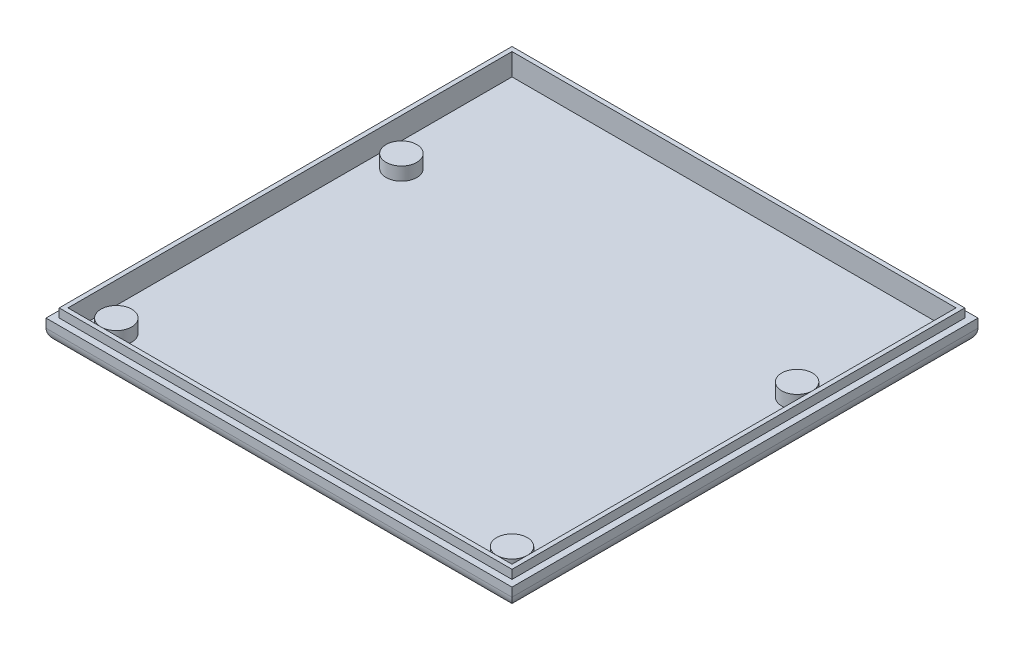
ISO-10303-21;
HEADER;
FILE_DESCRIPTION(('STEP AP214'),'2;1');
FILE_NAME('part.step','',(''),(''),'','','');
FILE_SCHEMA(('AUTOMOTIVE_DESIGN { 1 0 10303 214 1 1 1 1 }'));
ENDSEC;
DATA;
#1=APPLICATION_CONTEXT('core data for automotive mechanical design processes');
#2=APPLICATION_PROTOCOL_DEFINITION('international standard','automotive_design',2000,#1);
#3=PRODUCT_CONTEXT('',#1,'mechanical');
#4=PRODUCT('Part','Part','',(#3));
#5=PRODUCT_RELATED_PRODUCT_CATEGORY('part','',(#4));
#6=PRODUCT_DEFINITION_FORMATION('','',#4);
#7=PRODUCT_DEFINITION_CONTEXT('part definition',#1,'design');
#8=PRODUCT_DEFINITION('design','',#6,#7);
#9=PRODUCT_DEFINITION_SHAPE('','',#8);
#10=(LENGTH_UNIT() NAMED_UNIT(*) SI_UNIT(.MILLI.,.METRE.));
#11=(NAMED_UNIT(*) PLANE_ANGLE_UNIT() SI_UNIT($,.RADIAN.));
#12=(NAMED_UNIT(*) SI_UNIT($,.STERADIAN.) SOLID_ANGLE_UNIT());
#13=UNCERTAINTY_MEASURE_WITH_UNIT(LENGTH_MEASURE(1.E-05),#10,'distance_accuracy_value','');
#14=(GEOMETRIC_REPRESENTATION_CONTEXT(3) GLOBAL_UNCERTAINTY_ASSIGNED_CONTEXT((#13)) GLOBAL_UNIT_ASSIGNED_CONTEXT((#10,
#11,#12)) REPRESENTATION_CONTEXT('',''));
#15=CARTESIAN_POINT('',(0.,0.,0.));
#16=DIRECTION('',(0.,0.,1.));
#17=DIRECTION('',(1.,0.,0.));
#18=AXIS2_PLACEMENT_3D('',#15,#16,#17);
#19=CARTESIAN_POINT('',(0.,5.,0.));
#20=DIRECTION('',(0.,1.,0.));
#21=DIRECTION('',(0.,0.,1.));
#22=AXIS2_PLACEMENT_3D('',#19,#20,#21);
#23=PLANE('',#22);
#24=DIRECTION('',(0.,0.,-1.));
#25=VECTOR('',#24,1.);
#26=CARTESIAN_POINT('',(5.31045751633987,5.,-8.53921568627451));
#27=LINE('',#26,#25);
#28=CARTESIAN_POINT('',(5.31045751633988,5.,97.4607843137255));
#29=VERTEX_POINT('',#28);
#30=CARTESIAN_POINT('',(5.31045751633987,5.,-8.53921568627451));
#31=VERTEX_POINT('',#30);
#32=EDGE_CURVE('E233',#29,#31,#27,.T.);
#33=ORIENTED_EDGE('',*,*,#32,.T.);
#34=DIRECTION('',(-1.,0.,0.));
#35=VECTOR('',#34,1.);
#36=CARTESIAN_POINT('',(-100.68954248366,5.,-8.53921568627451));
#37=LINE('',#36,#35);
#38=CARTESIAN_POINT('',(-100.68954248366,5.,-8.53921568627451));
#39=VERTEX_POINT('',#38);
#40=EDGE_CURVE('E239',#31,#39,#37,.T.);
#41=ORIENTED_EDGE('',*,*,#40,.T.);
#42=DIRECTION('',(0.,0.,1.));
#43=VECTOR('',#42,1.);
#44=CARTESIAN_POINT('',(-100.68954248366,5.,-8.53921568627451));
#45=LINE('',#44,#43);
#46=CARTESIAN_POINT('',(-100.68954248366,5.,97.4607843137255));
#47=VERTEX_POINT('',#46);
#48=EDGE_CURVE('E241',#39,#47,#45,.T.);
#49=ORIENTED_EDGE('',*,*,#48,.T.);
#50=DIRECTION('',(1.,0.,0.));
#51=VECTOR('',#50,1.);
#52=CARTESIAN_POINT('',(-100.68954248366,5.,97.4607843137255));
#53=LINE('',#52,#51);
#54=EDGE_CURVE('E243',#47,#29,#53,.T.);
#55=ORIENTED_EDGE('',*,*,#54,.T.);
#56=EDGE_LOOP('',(#33,#41,#49,#55));
#57=FACE_BOUND('',#56,.T.);
#58=DIRECTION('',(-1.,0.,0.));
#59=VECTOR('',#58,1.);
#60=CARTESIAN_POINT('',(-99.1895424836601,5.,-7.03921568627452));
#61=LINE('',#60,#59);
#62=CARTESIAN_POINT('',(3.81045751633986,5.,-7.03921568627452));
#63=VERTEX_POINT('',#62);
#64=CARTESIAN_POINT('',(-99.1895424836601,5.,-7.03921568627452));
#65=VERTEX_POINT('',#64);
#66=EDGE_CURVE('E186',#63,#65,#61,.T.);
#67=ORIENTED_EDGE('',*,*,#66,.F.);
#68=DIRECTION('',(0.,0.,-1.));
#69=VECTOR('',#68,1.);
#70=CARTESIAN_POINT('',(3.81045751633986,5.,-7.03921568627452));
#71=LINE('',#70,#69);
#72=CARTESIAN_POINT('',(3.81045751633986,5.,95.9607843137255));
#73=VERTEX_POINT('',#72);
#74=EDGE_CURVE('E172',#73,#63,#71,.T.);
#75=ORIENTED_EDGE('',*,*,#74,.F.);
#76=DIRECTION('',(1.,0.,0.));
#77=VECTOR('',#76,1.);
#78=CARTESIAN_POINT('',(-99.1895424836601,5.,95.9607843137255));
#79=LINE('',#78,#77);
#80=CARTESIAN_POINT('',(-99.1895424836601,5.,95.9607843137255));
#81=VERTEX_POINT('',#80);
#82=EDGE_CURVE('E177',#81,#73,#79,.T.);
#83=ORIENTED_EDGE('',*,*,#82,.F.);
#84=DIRECTION('',(0.,0.,1.));
#85=VECTOR('',#84,1.);
#86=CARTESIAN_POINT('',(-99.1895424836601,5.,-7.03921568627452));
#87=LINE('',#86,#85);
#88=EDGE_CURVE('E188',#65,#81,#87,.T.);
#89=ORIENTED_EDGE('',*,*,#88,.F.);
#90=EDGE_LOOP('',(#67,#75,#83,#89));
#91=FACE_BOUND('',#90,.T.);
#92=ADVANCED_FACE('F38',(#57,#91),#23,.T.);
#93=CARTESIAN_POINT('',(5.31045751633987,5.,-8.53921568627451));
#94=DIRECTION('',(-1.,0.,0.));
#95=DIRECTION('',(0.,0.,1.));
#96=AXIS2_PLACEMENT_3D('',#93,#94,#95);
#97=PLANE('',#96);
#98=DIRECTION('',(0.,-1.,0.));
#99=VECTOR('',#98,1.);
#100=CARTESIAN_POINT('',(5.31045751633988,5.,97.4607843137255));
#101=LINE('',#100,#99);
#102=CARTESIAN_POINT('',(5.31045751633988,3.,97.4607843137255));
#103=VERTEX_POINT('',#102);
#104=EDGE_CURVE('E245',#29,#103,#101,.T.);
#105=ORIENTED_EDGE('',*,*,#104,.T.);
#106=DIRECTION('',(0.,0.,-1.));
#107=VECTOR('',#106,1.);
#108=CARTESIAN_POINT('',(5.31045751633987,3.,-8.53921568627451));
#109=LINE('',#108,#107);
#110=CARTESIAN_POINT('',(5.31045751633987,3.,-8.53921568627451));
#111=VERTEX_POINT('',#110);
#112=EDGE_CURVE('E11',#103,#111,#109,.T.);
#113=ORIENTED_EDGE('',*,*,#112,.T.);
#114=DIRECTION('',(0.,-1.,0.));
#115=VECTOR('',#114,1.);
#116=CARTESIAN_POINT('',(5.31045751633987,5.,-8.53921568627451));
#117=LINE('',#116,#115);
#118=EDGE_CURVE('E253',#31,#111,#117,.T.);
#119=ORIENTED_EDGE('',*,*,#118,.F.);
#120=ORIENTED_EDGE('',*,*,#32,.F.);
#121=EDGE_LOOP('',(#105,#113,#119,#120));
#122=FACE_BOUND('',#121,.T.);
#123=ADVANCED_FACE('F301',(#122),#97,.F.);
#124=CARTESIAN_POINT('',(-100.68954248366,5.,-8.53921568627451));
#125=DIRECTION('',(0.,0.,1.));
#126=DIRECTION('',(1.,0.,0.));
#127=AXIS2_PLACEMENT_3D('',#124,#125,#126);
#128=PLANE('',#127);
#129=ORIENTED_EDGE('',*,*,#118,.T.);
#130=DIRECTION('',(-1.,0.,0.));
#131=VECTOR('',#130,1.);
#132=CARTESIAN_POINT('',(-100.68954248366,3.,-8.53921568627451));
#133=LINE('',#132,#131);
#134=CARTESIAN_POINT('',(-100.68954248366,3.,-8.53921568627451));
#135=VERTEX_POINT('',#134);
#136=EDGE_CURVE('E47',#111,#135,#133,.T.);
#137=ORIENTED_EDGE('',*,*,#136,.T.);
#138=DIRECTION('',(0.,-1.,0.));
#139=VECTOR('',#138,1.);
#140=CARTESIAN_POINT('',(-100.68954248366,5.,-8.53921568627451));
#141=LINE('',#140,#139);
#142=EDGE_CURVE('E250',#39,#135,#141,.T.);
#143=ORIENTED_EDGE('',*,*,#142,.F.);
#144=ORIENTED_EDGE('',*,*,#40,.F.);
#145=EDGE_LOOP('',(#129,#137,#143,#144));
#146=FACE_BOUND('',#145,.T.);
#147=ADVANCED_FACE('F309',(#146),#128,.F.);
#148=CARTESIAN_POINT('',(-100.68954248366,5.,-8.53921568627451));
#149=DIRECTION('',(1.,0.,0.));
#150=DIRECTION('',(0.,0.,-1.));
#151=AXIS2_PLACEMENT_3D('',#148,#149,#150);
#152=PLANE('',#151);
#153=ORIENTED_EDGE('',*,*,#142,.T.);
#154=DIRECTION('',(0.,0.,1.));
#155=VECTOR('',#154,1.);
#156=CARTESIAN_POINT('',(-100.68954248366,3.,-8.53921568627451));
#157=LINE('',#156,#155);
#158=CARTESIAN_POINT('',(-100.68954248366,3.,97.4607843137255));
#159=VERTEX_POINT('',#158);
#160=EDGE_CURVE('E267',#135,#159,#157,.T.);
#161=ORIENTED_EDGE('',*,*,#160,.T.);
#162=DIRECTION('',(0.,-1.,0.));
#163=VECTOR('',#162,1.);
#164=CARTESIAN_POINT('',(-100.68954248366,5.,97.4607843137255));
#165=LINE('',#164,#163);
#166=EDGE_CURVE('E247',#47,#159,#165,.T.);
#167=ORIENTED_EDGE('',*,*,#166,.F.);
#168=ORIENTED_EDGE('',*,*,#48,.F.);
#169=EDGE_LOOP('',(#153,#161,#167,#168));
#170=FACE_BOUND('',#169,.T.);
#171=ADVANCED_FACE('F307',(#170),#152,.F.);
#172=CARTESIAN_POINT('',(-100.68954248366,5.,97.4607843137255));
#173=DIRECTION('',(0.,0.,-1.));
#174=DIRECTION('',(-1.,0.,0.));
#175=AXIS2_PLACEMENT_3D('',#172,#173,#174);
#176=PLANE('',#175);
#177=ORIENTED_EDGE('',*,*,#166,.T.);
#178=DIRECTION('',(1.,0.,0.));
#179=VECTOR('',#178,1.);
#180=CARTESIAN_POINT('',(-100.68954248366,3.,97.4607843137255));
#181=LINE('',#180,#179);
#182=EDGE_CURVE('E255',#159,#103,#181,.T.);
#183=ORIENTED_EDGE('',*,*,#182,.T.);
#184=ORIENTED_EDGE('',*,*,#104,.F.);
#185=ORIENTED_EDGE('',*,*,#54,.F.);
#186=EDGE_LOOP('',(#177,#183,#184,#185));
#187=FACE_BOUND('',#186,.T.);
#188=ADVANCED_FACE('F297',(#187),#176,.F.);
#189=CARTESIAN_POINT('',(0.,0.,0.));
#190=DIRECTION('',(0.,1.,0.));
#191=DIRECTION('',(0.,0.,1.));
#192=AXIS2_PLACEMENT_3D('',#189,#190,#191);
#193=PLANE('',#192);
#194=DIRECTION('',(0.,0.,-1.));
#195=VECTOR('',#194,1.);
#196=CARTESIAN_POINT('',(2.31045751633987,0.,0.));
#197=LINE('',#196,#195);
#198=CARTESIAN_POINT('',(2.31045751633987,0.,-5.53921568627452));
#199=VERTEX_POINT('',#198);
#200=CARTESIAN_POINT('',(2.31045751633988,0.,94.4607843137255));
#201=VERTEX_POINT('',#200);
#202=EDGE_CURVE('E258',#199,#201,#197,.F.);
#203=ORIENTED_EDGE('',*,*,#202,.T.);
#204=DIRECTION('',(1.,0.,0.));
#205=VECTOR('',#204,1.);
#206=CARTESIAN_POINT('',(0.,0.,94.4607843137255));
#207=LINE('',#206,#205);
#208=CARTESIAN_POINT('',(-97.6895424836601,0.,94.4607843137255));
#209=VERTEX_POINT('',#208);
#210=EDGE_CURVE('E264',#201,#209,#207,.F.);
#211=ORIENTED_EDGE('',*,*,#210,.T.);
#212=DIRECTION('',(0.,0.,1.));
#213=VECTOR('',#212,1.);
#214=CARTESIAN_POINT('',(-97.6895424836601,0.,0.));
#215=LINE('',#214,#213);
#216=CARTESIAN_POINT('',(-97.6895424836601,0.,-5.53921568627452));
#217=VERTEX_POINT('',#216);
#218=EDGE_CURVE('E262',#209,#217,#215,.F.);
#219=ORIENTED_EDGE('',*,*,#218,.T.);
#220=DIRECTION('',(-1.,0.,0.));
#221=VECTOR('',#220,1.);
#222=CARTESIAN_POINT('',(0.,0.,-5.53921568627452));
#223=LINE('',#222,#221);
#224=EDGE_CURVE('E260',#217,#199,#223,.F.);
#225=ORIENTED_EDGE('',*,*,#224,.T.);
#226=EDGE_LOOP('',(#203,#211,#219,#225));
#227=FACE_BOUND('',#226,.T.);
#228=ADVANCED_FACE('F288',(#227),#193,.F.);
#229=CARTESIAN_POINT('',(-100.68954248366,3.,-5.53921568627452));
#230=DIRECTION('',(-1.,0.,0.));
#231=DIRECTION('',(0.,0.,1.));
#232=AXIS2_PLACEMENT_3D('',#229,#230,#231);
#233=CYLINDRICAL_SURFACE('',#232,3.);
#234=CARTESIAN_POINT('',(2.31045751633987,3.,-5.53921568627452));
#235=DIRECTION('',(-0.707106781186548,0.,-0.707106781186547));
#236=DIRECTION('',(0.707106781186547,0.,-0.707106781186548));
#237=AXIS2_PLACEMENT_3D('',#234,#235,#236);
#238=ELLIPSE('',#237,4.24264068711928,3.);
#239=EDGE_CURVE('E272',#199,#111,#238,.F.);
#240=ORIENTED_EDGE('',*,*,#239,.F.);
#241=ORIENTED_EDGE('',*,*,#224,.F.);
#242=CARTESIAN_POINT('',(-97.6895424836601,3.,-5.53921568627452));
#243=DIRECTION('',(-0.707106781186547,0.,0.707106781186548));
#244=DIRECTION('',(-0.707106781186548,0.,-0.707106781186547));
#245=AXIS2_PLACEMENT_3D('',#242,#243,#244);
#246=ELLIPSE('',#245,4.24264068711929,3.);
#247=EDGE_CURVE('E42',#135,#217,#246,.T.);
#248=ORIENTED_EDGE('',*,*,#247,.F.);
#249=ORIENTED_EDGE('',*,*,#136,.F.);
#250=EDGE_LOOP('',(#240,#241,#248,#249));
#251=FACE_BOUND('',#250,.T.);
#252=ADVANCED_FACE('F40',(#251),#233,.T.);
#253=CARTESIAN_POINT('',(-97.6895424836601,3.,-8.53921568627451));
#254=DIRECTION('',(0.,0.,1.));
#255=DIRECTION('',(1.,0.,0.));
#256=AXIS2_PLACEMENT_3D('',#253,#254,#255);
#257=CYLINDRICAL_SURFACE('',#256,3.);
#258=ORIENTED_EDGE('',*,*,#247,.T.);
#259=ORIENTED_EDGE('',*,*,#218,.F.);
#260=CARTESIAN_POINT('',(-97.6895424836601,3.,94.4607843137255));
#261=DIRECTION('',(0.707106781186548,0.,0.707106781186547));
#262=DIRECTION('',(-0.707106781186547,0.,0.707106781186548));
#263=AXIS2_PLACEMENT_3D('',#260,#261,#262);
#264=ELLIPSE('',#263,4.24264068711928,3.);
#265=EDGE_CURVE('E271',#159,#209,#264,.T.);
#266=ORIENTED_EDGE('',*,*,#265,.F.);
#267=ORIENTED_EDGE('',*,*,#160,.F.);
#268=EDGE_LOOP('',(#258,#259,#266,#267));
#269=FACE_BOUND('',#268,.T.);
#270=ADVANCED_FACE('F282',(#269),#257,.T.);
#271=CARTESIAN_POINT('',(2.31045751633987,3.,-8.53921568627451));
#272=DIRECTION('',(0.,0.,-1.));
#273=DIRECTION('',(-1.,0.,0.));
#274=AXIS2_PLACEMENT_3D('',#271,#272,#273);
#275=CYLINDRICAL_SURFACE('',#274,3.);
#276=ORIENTED_EDGE('',*,*,#239,.T.);
#277=ORIENTED_EDGE('',*,*,#112,.F.);
#278=CARTESIAN_POINT('',(2.31045751633988,3.,94.4607843137255));
#279=DIRECTION('',(0.707106781186547,0.,-0.707106781186548));
#280=DIRECTION('',(-0.707106781186548,0.,-0.707106781186547));
#281=AXIS2_PLACEMENT_3D('',#278,#279,#280);
#282=ELLIPSE('',#281,4.24264068711929,3.);
#283=EDGE_CURVE('E199',#201,#103,#282,.F.);
#284=ORIENTED_EDGE('',*,*,#283,.F.);
#285=ORIENTED_EDGE('',*,*,#202,.F.);
#286=EDGE_LOOP('',(#276,#277,#284,#285));
#287=FACE_BOUND('',#286,.T.);
#288=ADVANCED_FACE('F294',(#287),#275,.T.);
#289=CARTESIAN_POINT('',(-100.68954248366,3.,94.4607843137255));
#290=DIRECTION('',(1.,0.,0.));
#291=DIRECTION('',(0.,0.,-1.));
#292=AXIS2_PLACEMENT_3D('',#289,#290,#291);
#293=CYLINDRICAL_SURFACE('',#292,3.);
#294=ORIENTED_EDGE('',*,*,#265,.T.);
#295=ORIENTED_EDGE('',*,*,#210,.F.);
#296=ORIENTED_EDGE('',*,*,#283,.T.);
#297=ORIENTED_EDGE('',*,*,#182,.F.);
#298=EDGE_LOOP('',(#294,#295,#296,#297));
#299=FACE_BOUND('',#298,.T.);
#300=ADVANCED_FACE('F292',(#299),#293,.T.);
#301=CARTESIAN_POINT('',(0.,7.,0.));
#302=DIRECTION('',(0.,1.,0.));
#303=DIRECTION('',(0.,0.,1.));
#304=AXIS2_PLACEMENT_3D('',#301,#302,#303);
#305=PLANE('',#304);
#306=DIRECTION('',(0.,0.,-1.));
#307=VECTOR('',#306,1.);
#308=CARTESIAN_POINT('',(3.81045751633986,7.,-7.03921568627452));
#309=LINE('',#308,#307);
#310=CARTESIAN_POINT('',(3.81045751633986,7.,95.9607843137255));
#311=VERTEX_POINT('',#310);
#312=CARTESIAN_POINT('',(3.81045751633986,7.,-7.03921568627452));
#313=VERTEX_POINT('',#312);
#314=EDGE_CURVE('E173',#311,#313,#309,.T.);
#315=ORIENTED_EDGE('',*,*,#314,.T.);
#316=DIRECTION('',(-1.,0.,0.));
#317=VECTOR('',#316,1.);
#318=CARTESIAN_POINT('',(-99.1895424836601,7.,-7.03921568627452));
#319=LINE('',#318,#317);
#320=CARTESIAN_POINT('',(-99.1895424836601,7.,-7.03921568627452));
#321=VERTEX_POINT('',#320);
#322=EDGE_CURVE('E176',#313,#321,#319,.T.);
#323=ORIENTED_EDGE('',*,*,#322,.T.);
#324=DIRECTION('',(0.,0.,1.));
#325=VECTOR('',#324,1.);
#326=CARTESIAN_POINT('',(-99.1895424836601,7.,-7.03921568627452));
#327=LINE('',#326,#325);
#328=CARTESIAN_POINT('',(-99.1895424836601,7.,95.9607843137255));
#329=VERTEX_POINT('',#328);
#330=EDGE_CURVE('E179',#321,#329,#327,.T.);
#331=ORIENTED_EDGE('',*,*,#330,.T.);
#332=DIRECTION('',(1.,0.,0.));
#333=VECTOR('',#332,1.);
#334=CARTESIAN_POINT('',(-99.1895424836601,7.,95.9607843137255));
#335=LINE('',#334,#333);
#336=EDGE_CURVE('E181',#329,#311,#335,.T.);
#337=ORIENTED_EDGE('',*,*,#336,.T.);
#338=EDGE_LOOP('',(#315,#323,#331,#337));
#339=FACE_BOUND('',#338,.T.);
#340=DIRECTION('',(-1.,0.,0.));
#341=VECTOR('',#340,1.);
#342=CARTESIAN_POINT('',(-98.1895424836601,7.,-6.03921568627448));
#343=LINE('',#342,#341);
#344=CARTESIAN_POINT('',(2.81045751633989,7.,-6.03921568627448));
#345=VERTEX_POINT('',#344);
#346=CARTESIAN_POINT('',(-98.1895424836601,7.,-6.03921568627448));
#347=VERTEX_POINT('',#346);
#348=EDGE_CURVE('E146',#345,#347,#343,.T.);
#349=ORIENTED_EDGE('',*,*,#348,.F.);
#350=DIRECTION('',(0.,0.,-1.));
#351=VECTOR('',#350,1.);
#352=CARTESIAN_POINT('',(2.81045751633989,7.,-6.03921568627448));
#353=LINE('',#352,#351);
#354=CARTESIAN_POINT('',(2.81045751633989,7.,94.9607843137255));
#355=VERTEX_POINT('',#354);
#356=EDGE_CURVE('E157',#355,#345,#353,.T.);
#357=ORIENTED_EDGE('',*,*,#356,.F.);
#358=DIRECTION('',(1.,0.,0.));
#359=VECTOR('',#358,1.);
#360=CARTESIAN_POINT('',(-98.1895424836601,7.,94.9607843137255));
#361=LINE('',#360,#359);
#362=CARTESIAN_POINT('',(-98.1895424836601,7.,94.9607843137255));
#363=VERTEX_POINT('',#362);
#364=EDGE_CURVE('E168',#363,#355,#361,.T.);
#365=ORIENTED_EDGE('',*,*,#364,.F.);
#366=DIRECTION('',(0.,0.,1.));
#367=VECTOR('',#366,1.);
#368=CARTESIAN_POINT('',(-98.1895424836601,7.,-6.03921568627448));
#369=LINE('',#368,#367);
#370=EDGE_CURVE('E166',#347,#363,#369,.T.);
#371=ORIENTED_EDGE('',*,*,#370,.F.);
#372=EDGE_LOOP('',(#349,#357,#365,#371));
#373=FACE_BOUND('',#372,.T.);
#374=ADVANCED_FACE('F164',(#339,#373),#305,.T.);
#375=CARTESIAN_POINT('',(3.81045751633986,7.,-7.03921568627452));
#376=DIRECTION('',(-1.,0.,0.));
#377=DIRECTION('',(0.,0.,1.));
#378=AXIS2_PLACEMENT_3D('',#375,#376,#377);
#379=PLANE('',#378);
#380=ORIENTED_EDGE('',*,*,#74,.T.);
#381=DIRECTION('',(0.,-1.,0.));
#382=VECTOR('',#381,1.);
#383=CARTESIAN_POINT('',(3.81045751633986,7.,-7.03921568627452));
#384=LINE('',#383,#382);
#385=EDGE_CURVE('E197',#313,#63,#384,.T.);
#386=ORIENTED_EDGE('',*,*,#385,.F.);
#387=ORIENTED_EDGE('',*,*,#314,.F.);
#388=DIRECTION('',(0.,-1.,0.));
#389=VECTOR('',#388,1.);
#390=CARTESIAN_POINT('',(3.81045751633986,7.,95.9607843137255));
#391=LINE('',#390,#389);
#392=EDGE_CURVE('E183',#311,#73,#391,.T.);
#393=ORIENTED_EDGE('',*,*,#392,.T.);
#394=EDGE_LOOP('',(#380,#386,#387,#393));
#395=FACE_BOUND('',#394,.T.);
#396=ADVANCED_FACE('F379',(#395),#379,.F.);
#397=CARTESIAN_POINT('',(-99.1895424836601,7.,-7.03921568627452));
#398=DIRECTION('',(0.,0.,1.));
#399=DIRECTION('',(1.,0.,0.));
#400=AXIS2_PLACEMENT_3D('',#397,#398,#399);
#401=PLANE('',#400);
#402=ORIENTED_EDGE('',*,*,#66,.T.);
#403=DIRECTION('',(0.,-1.,0.));
#404=VECTOR('',#403,1.);
#405=CARTESIAN_POINT('',(-99.1895424836601,7.,-7.03921568627452));
#406=LINE('',#405,#404);
#407=EDGE_CURVE('E194',#321,#65,#406,.T.);
#408=ORIENTED_EDGE('',*,*,#407,.F.);
#409=ORIENTED_EDGE('',*,*,#322,.F.);
#410=ORIENTED_EDGE('',*,*,#385,.T.);
#411=EDGE_LOOP('',(#402,#408,#409,#410));
#412=FACE_BOUND('',#411,.T.);
#413=ADVANCED_FACE('F389',(#412),#401,.F.);
#414=CARTESIAN_POINT('',(-99.1895424836601,7.,-7.03921568627452));
#415=DIRECTION('',(1.,0.,0.));
#416=DIRECTION('',(0.,0.,-1.));
#417=AXIS2_PLACEMENT_3D('',#414,#415,#416);
#418=PLANE('',#417);
#419=ORIENTED_EDGE('',*,*,#88,.T.);
#420=DIRECTION('',(0.,-1.,0.));
#421=VECTOR('',#420,1.);
#422=CARTESIAN_POINT('',(-99.1895424836601,7.,95.9607843137255));
#423=LINE('',#422,#421);
#424=EDGE_CURVE('E55',#329,#81,#423,.T.);
#425=ORIENTED_EDGE('',*,*,#424,.F.);
#426=ORIENTED_EDGE('',*,*,#330,.F.);
#427=ORIENTED_EDGE('',*,*,#407,.T.);
#428=EDGE_LOOP('',(#419,#425,#426,#427));
#429=FACE_BOUND('',#428,.T.);
#430=ADVANCED_FACE('F399',(#429),#418,.F.);
#431=CARTESIAN_POINT('',(-99.1895424836601,7.,95.9607843137255));
#432=DIRECTION('',(0.,0.,-1.));
#433=DIRECTION('',(-1.,0.,0.));
#434=AXIS2_PLACEMENT_3D('',#431,#432,#433);
#435=PLANE('',#434);
#436=ORIENTED_EDGE('',*,*,#82,.T.);
#437=ORIENTED_EDGE('',*,*,#392,.F.);
#438=ORIENTED_EDGE('',*,*,#336,.F.);
#439=ORIENTED_EDGE('',*,*,#424,.T.);
#440=EDGE_LOOP('',(#436,#437,#438,#439));
#441=FACE_BOUND('',#440,.T.);
#442=ADVANCED_FACE('F409',(#441),#435,.F.);
#443=CARTESIAN_POINT('',(-2.68954248366011,5.,24.6107843137255));
#444=DIRECTION('',(0.,1.,0.));
#445=DIRECTION('',(0.,0.,1.));
#446=AXIS2_PLACEMENT_3D('',#443,#444,#445);
#447=PLANE('',#446);
#448=CARTESIAN_POINT('',(-2.68954248366011,5.,24.6107843137255));
#449=DIRECTION('',(0.,1.,0.));
#450=DIRECTION('',(0.,0.,1.));
#451=AXIS2_PLACEMENT_3D('',#448,#449,#450);
#452=CIRCLE('',#451,3.5);
#453=CARTESIAN_POINT('',(-2.68954248366011,5.,28.1107843137255));
#454=VERTEX_POINT('',#453);
#455=EDGE_CURVE('E219',#454,#454,#452,.T.);
#456=ORIENTED_EDGE('',*,*,#455,.T.);
#457=EDGE_LOOP('',(#456));
#458=FACE_BOUND('',#457,.T.);
#459=ADVANCED_FACE('F419',(#458),#447,.T.);
#460=CARTESIAN_POINT('',(-92.6895424836601,5.,24.6107843137255));
#461=DIRECTION('',(0.,1.,0.));
#462=DIRECTION('',(0.,0.,1.));
#463=AXIS2_PLACEMENT_3D('',#460,#461,#462);
#464=PLANE('',#463);
#465=CARTESIAN_POINT('',(-92.6895424836601,5.,24.6107843137255));
#466=DIRECTION('',(0.,1.,0.));
#467=DIRECTION('',(0.,0.,1.));
#468=AXIS2_PLACEMENT_3D('',#465,#466,#467);
#469=CIRCLE('',#468,3.50000000000001);
#470=CARTESIAN_POINT('',(-92.6895424836601,5.,28.1107843137255));
#471=VERTEX_POINT('',#470);
#472=EDGE_CURVE('E204',#471,#471,#469,.T.);
#473=ORIENTED_EDGE('',*,*,#472,.T.);
#474=EDGE_LOOP('',(#473));
#475=FACE_BOUND('',#474,.T.);
#476=ADVANCED_FACE('F494',(#475),#464,.T.);
#477=CARTESIAN_POINT('',(-92.6895424836601,5.,89.4607843137255));
#478=DIRECTION('',(0.,1.,0.));
#479=DIRECTION('',(0.,0.,1.));
#480=AXIS2_PLACEMENT_3D('',#477,#478,#479);
#481=PLANE('',#480);
#482=CARTESIAN_POINT('',(-92.6895424836601,5.,89.4607843137255));
#483=DIRECTION('',(0.,1.,0.));
#484=DIRECTION('',(0.,0.,1.));
#485=AXIS2_PLACEMENT_3D('',#482,#483,#484);
#486=CIRCLE('',#485,3.50000000000001);
#487=CARTESIAN_POINT('',(-92.6895424836601,5.,92.9607843137255));
#488=VERTEX_POINT('',#487);
#489=EDGE_CURVE('E210',#488,#488,#486,.T.);
#490=ORIENTED_EDGE('',*,*,#489,.T.);
#491=EDGE_LOOP('',(#490));
#492=FACE_BOUND('',#491,.T.);
#493=ADVANCED_FACE('F512',(#492),#481,.T.);
#494=CARTESIAN_POINT('',(-2.68954248366011,5.,89.4607843137255));
#495=DIRECTION('',(0.,1.,0.));
#496=DIRECTION('',(0.,0.,1.));
#497=AXIS2_PLACEMENT_3D('',#494,#495,#496);
#498=PLANE('',#497);
#499=CARTESIAN_POINT('',(-2.68954248366011,5.,89.4607843137255));
#500=DIRECTION('',(0.,1.,0.));
#501=DIRECTION('',(0.,0.,1.));
#502=AXIS2_PLACEMENT_3D('',#499,#500,#501);
#503=CIRCLE('',#502,3.5);
#504=CARTESIAN_POINT('',(-2.68954248366011,5.,92.9607843137255));
#505=VERTEX_POINT('',#504);
#506=EDGE_CURVE('E216',#505,#505,#503,.T.);
#507=ORIENTED_EDGE('',*,*,#506,.T.);
#508=EDGE_LOOP('',(#507));
#509=FACE_BOUND('',#508,.T.);
#510=ADVANCED_FACE('F485',(#509),#498,.T.);
#511=CARTESIAN_POINT('',(-2.68954248366011,5.,24.6107843137255));
#512=DIRECTION('',(0.,-1.,0.));
#513=DIRECTION('',(0.,0.,-1.));
#514=AXIS2_PLACEMENT_3D('',#511,#512,#513);
#515=CYLINDRICAL_SURFACE('',#514,3.5);
#516=ORIENTED_EDGE('',*,*,#455,.F.);
#517=EDGE_LOOP('',(#516));
#518=FACE_BOUND('',#517,.T.);
#519=CARTESIAN_POINT('',(-2.68954248366011,2.,24.6107843137255));
#520=DIRECTION('',(0.,1.,0.));
#521=DIRECTION('',(0.,0.,1.));
#522=AXIS2_PLACEMENT_3D('',#519,#520,#521);
#523=CIRCLE('',#522,3.5);
#524=CARTESIAN_POINT('',(-2.68954248366011,2.,28.1107843137255));
#525=VERTEX_POINT('',#524);
#526=EDGE_CURVE('E203',#525,#525,#523,.T.);
#527=ORIENTED_EDGE('',*,*,#526,.T.);
#528=EDGE_LOOP('',(#527));
#529=FACE_BOUND('',#528,.T.);
#530=ADVANCED_FACE('F480',(#518,#529),#515,.T.);
#531=CARTESIAN_POINT('',(-92.6895424836601,5.,24.6107843137255));
#532=DIRECTION('',(0.,-1.,0.));
#533=DIRECTION('',(0.,0.,-1.));
#534=AXIS2_PLACEMENT_3D('',#531,#532,#533);
#535=CYLINDRICAL_SURFACE('',#534,3.50000000000001);
#536=ORIENTED_EDGE('',*,*,#472,.F.);
#537=EDGE_LOOP('',(#536));
#538=FACE_BOUND('',#537,.T.);
#539=CARTESIAN_POINT('',(-92.6895424836601,2.,24.6107843137255));
#540=DIRECTION('',(0.,1.,0.));
#541=DIRECTION('',(0.,0.,1.));
#542=AXIS2_PLACEMENT_3D('',#539,#540,#541);
#543=CIRCLE('',#542,3.50000000000001);
#544=CARTESIAN_POINT('',(-92.6895424836601,2.,28.1107843137255));
#545=VERTEX_POINT('',#544);
#546=EDGE_CURVE('E200',#545,#545,#543,.T.);
#547=ORIENTED_EDGE('',*,*,#546,.T.);
#548=EDGE_LOOP('',(#547));
#549=FACE_BOUND('',#548,.T.);
#550=ADVANCED_FACE('F484',(#538,#549),#535,.T.);
#551=CARTESIAN_POINT('',(-92.6895424836601,5.,89.4607843137255));
#552=DIRECTION('',(0.,-1.,0.));
#553=DIRECTION('',(0.,0.,-1.));
#554=AXIS2_PLACEMENT_3D('',#551,#552,#553);
#555=CYLINDRICAL_SURFACE('',#554,3.50000000000001);
#556=ORIENTED_EDGE('',*,*,#489,.F.);
#557=EDGE_LOOP('',(#556));
#558=FACE_BOUND('',#557,.T.);
#559=CARTESIAN_POINT('',(-92.6895424836601,2.,89.4607843137255));
#560=DIRECTION('',(0.,1.,0.));
#561=DIRECTION('',(0.,0.,1.));
#562=AXIS2_PLACEMENT_3D('',#559,#560,#561);
#563=CIRCLE('',#562,3.50000000000001);
#564=CARTESIAN_POINT('',(-92.6895424836601,2.,92.9607843137255));
#565=VERTEX_POINT('',#564);
#566=EDGE_CURVE('E207',#565,#565,#563,.T.);
#567=ORIENTED_EDGE('',*,*,#566,.T.);
#568=EDGE_LOOP('',(#567));
#569=FACE_BOUND('',#568,.T.);
#570=ADVANCED_FACE('F503',(#558,#569),#555,.T.);
#571=CARTESIAN_POINT('',(-2.68954248366011,5.,89.4607843137255));
#572=DIRECTION('',(0.,-1.,0.));
#573=DIRECTION('',(0.,0.,-1.));
#574=AXIS2_PLACEMENT_3D('',#571,#572,#573);
#575=CYLINDRICAL_SURFACE('',#574,3.5);
#576=ORIENTED_EDGE('',*,*,#506,.F.);
#577=EDGE_LOOP('',(#576));
#578=FACE_BOUND('',#577,.T.);
#579=CARTESIAN_POINT('',(-2.68954248366011,2.,89.4607843137255));
#580=DIRECTION('',(0.,1.,0.));
#581=DIRECTION('',(0.,0.,1.));
#582=AXIS2_PLACEMENT_3D('',#579,#580,#581);
#583=CIRCLE('',#582,3.5);
#584=CARTESIAN_POINT('',(-2.68954248366011,2.,92.9607843137255));
#585=VERTEX_POINT('',#584);
#586=EDGE_CURVE('E213',#585,#585,#583,.T.);
#587=ORIENTED_EDGE('',*,*,#586,.T.);
#588=EDGE_LOOP('',(#587));
#589=FACE_BOUND('',#588,.T.);
#590=ADVANCED_FACE('F474',(#578,#589),#575,.T.);
#591=CARTESIAN_POINT('',(0.,2.,0.));
#592=DIRECTION('',(0.,1.,0.));
#593=DIRECTION('',(0.,0.,1.));
#594=AXIS2_PLACEMENT_3D('',#591,#592,#593);
#595=PLANE('',#594);
#596=ORIENTED_EDGE('',*,*,#586,.F.);
#597=EDGE_LOOP('',(#596));
#598=FACE_BOUND('',#597,.T.);
#599=ORIENTED_EDGE('',*,*,#566,.F.);
#600=EDGE_LOOP('',(#599));
#601=FACE_BOUND('',#600,.T.);
#602=ORIENTED_EDGE('',*,*,#546,.F.);
#603=EDGE_LOOP('',(#602));
#604=FACE_BOUND('',#603,.T.);
#605=ORIENTED_EDGE('',*,*,#526,.F.);
#606=EDGE_LOOP('',(#605));
#607=FACE_BOUND('',#606,.T.);
#608=DIRECTION('',(0.,0.,-1.));
#609=VECTOR('',#608,1.);
#610=CARTESIAN_POINT('',(2.81045751633988,2.,-6.03921568627454));
#611=LINE('',#610,#609);
#612=CARTESIAN_POINT('',(2.81045751633989,2.,94.9607843137255));
#613=VERTEX_POINT('',#612);
#614=CARTESIAN_POINT('',(2.81045751633988,2.,-6.03921568627454));
#615=VERTEX_POINT('',#614);
#616=EDGE_CURVE('E222',#613,#615,#611,.T.);
#617=ORIENTED_EDGE('',*,*,#616,.T.);
#618=DIRECTION('',(-1.,0.,0.));
#619=VECTOR('',#618,1.);
#620=CARTESIAN_POINT('',(-98.1895424836601,2.,-6.03921568627454));
#621=LINE('',#620,#619);
#622=CARTESIAN_POINT('',(-98.1895424836601,2.,-6.03921568627454));
#623=VERTEX_POINT('',#622);
#624=EDGE_CURVE('E149',#615,#623,#621,.T.);
#625=ORIENTED_EDGE('',*,*,#624,.T.);
#626=DIRECTION('',(0.,0.,1.));
#627=VECTOR('',#626,1.);
#628=CARTESIAN_POINT('',(-98.1895424836601,2.,-6.03921568627454));
#629=LINE('',#628,#627);
#630=CARTESIAN_POINT('',(-98.1895424836601,2.,94.9607843137255));
#631=VERTEX_POINT('',#630);
#632=EDGE_CURVE('E227',#623,#631,#629,.T.);
#633=ORIENTED_EDGE('',*,*,#632,.T.);
#634=DIRECTION('',(1.,0.,0.));
#635=VECTOR('',#634,1.);
#636=CARTESIAN_POINT('',(-98.1895424836601,2.,94.9607843137255));
#637=LINE('',#636,#635);
#638=EDGE_CURVE('E154',#631,#613,#637,.T.);
#639=ORIENTED_EDGE('',*,*,#638,.T.);
#640=EDGE_LOOP('',(#617,#625,#633,#639));
#641=FACE_BOUND('',#640,.T.);
#642=ADVANCED_FACE('F429',(#598,#601,#604,#607,#641),#595,.T.);
#643=CARTESIAN_POINT('',(-98.1895424836601,2.,-6.03921568627454));
#644=DIRECTION('',(0.,0.,-1.));
#645=DIRECTION('',(-1.,0.,0.));
#646=AXIS2_PLACEMENT_3D('',#643,#644,#645);
#647=PLANE('',#646);
#648=DIRECTION('',(0.,1.,0.));
#649=VECTOR('',#648,1.);
#650=CARTESIAN_POINT('',(2.81045751633988,2.,-6.03921568627454));
#651=LINE('',#650,#649);
#652=EDGE_CURVE('E142',#615,#345,#651,.T.);
#653=ORIENTED_EDGE('',*,*,#652,.T.);
#654=ORIENTED_EDGE('',*,*,#348,.T.);
#655=DIRECTION('',(0.,1.,0.));
#656=VECTOR('',#655,1.);
#657=CARTESIAN_POINT('',(-98.1895424836601,2.,-6.03921568627454));
#658=LINE('',#657,#656);
#659=EDGE_CURVE('E153',#623,#347,#658,.T.);
#660=ORIENTED_EDGE('',*,*,#659,.F.);
#661=ORIENTED_EDGE('',*,*,#624,.F.);
#662=EDGE_LOOP('',(#653,#654,#660,#661));
#663=FACE_BOUND('',#662,.T.);
#664=ADVANCED_FACE('F144',(#663),#647,.F.);
#665=CARTESIAN_POINT('',(-98.1895424836601,2.,-6.03921568627454));
#666=DIRECTION('',(-1.,0.,0.));
#667=DIRECTION('',(0.,0.,1.));
#668=AXIS2_PLACEMENT_3D('',#665,#666,#667);
#669=PLANE('',#668);
#670=ORIENTED_EDGE('',*,*,#659,.T.);
#671=ORIENTED_EDGE('',*,*,#370,.T.);
#672=DIRECTION('',(0.,1.,0.));
#673=VECTOR('',#672,1.);
#674=CARTESIAN_POINT('',(-98.1895424836601,2.,94.9607843137255));
#675=LINE('',#674,#673);
#676=EDGE_CURVE('E234',#631,#363,#675,.T.);
#677=ORIENTED_EDGE('',*,*,#676,.F.);
#678=ORIENTED_EDGE('',*,*,#632,.F.);
#679=EDGE_LOOP('',(#670,#671,#677,#678));
#680=FACE_BOUND('',#679,.T.);
#681=ADVANCED_FACE('F428',(#680),#669,.F.);
#682=CARTESIAN_POINT('',(-98.1895424836601,2.,94.9607843137255));
#683=DIRECTION('',(0.,0.,1.));
#684=DIRECTION('',(1.,0.,0.));
#685=AXIS2_PLACEMENT_3D('',#682,#683,#684);
#686=PLANE('',#685);
#687=ORIENTED_EDGE('',*,*,#676,.T.);
#688=ORIENTED_EDGE('',*,*,#364,.T.);
#689=DIRECTION('',(0.,1.,0.));
#690=VECTOR('',#689,1.);
#691=CARTESIAN_POINT('',(2.81045751633989,2.,94.9607843137255));
#692=LINE('',#691,#690);
#693=EDGE_CURVE('E159',#613,#355,#692,.T.);
#694=ORIENTED_EDGE('',*,*,#693,.F.);
#695=ORIENTED_EDGE('',*,*,#638,.F.);
#696=EDGE_LOOP('',(#687,#688,#694,#695));
#697=FACE_BOUND('',#696,.T.);
#698=ADVANCED_FACE('F440',(#697),#686,.F.);
#699=CARTESIAN_POINT('',(2.81045751633988,2.,-6.03921568627454));
#700=DIRECTION('',(1.,0.,0.));
#701=DIRECTION('',(0.,0.,-1.));
#702=AXIS2_PLACEMENT_3D('',#699,#700,#701);
#703=PLANE('',#702);
#704=ORIENTED_EDGE('',*,*,#693,.T.);
#705=ORIENTED_EDGE('',*,*,#356,.T.);
#706=ORIENTED_EDGE('',*,*,#652,.F.);
#707=ORIENTED_EDGE('',*,*,#616,.F.);
#708=EDGE_LOOP('',(#704,#705,#706,#707));
#709=FACE_BOUND('',#708,.T.);
#710=ADVANCED_FACE('F158',(#709),#703,.F.);
#711=CLOSED_SHELL('',(#92,#123,#147,#171,#188,#228,#252,#270,#288,#300,#374,#396,#413,#430,#442,
#459,#476,#493,#510,#530,#550,#570,#590,#642,#664,#681,#698,#710));
#712=MANIFOLD_SOLID_BREP('B2',#711);
#713=ADVANCED_BREP_SHAPE_REPRESENTATION('',(#18,#712),#14);
#714=SHAPE_DEFINITION_REPRESENTATION(#9,#713);
ENDSEC;
END-ISO-10303-21;
